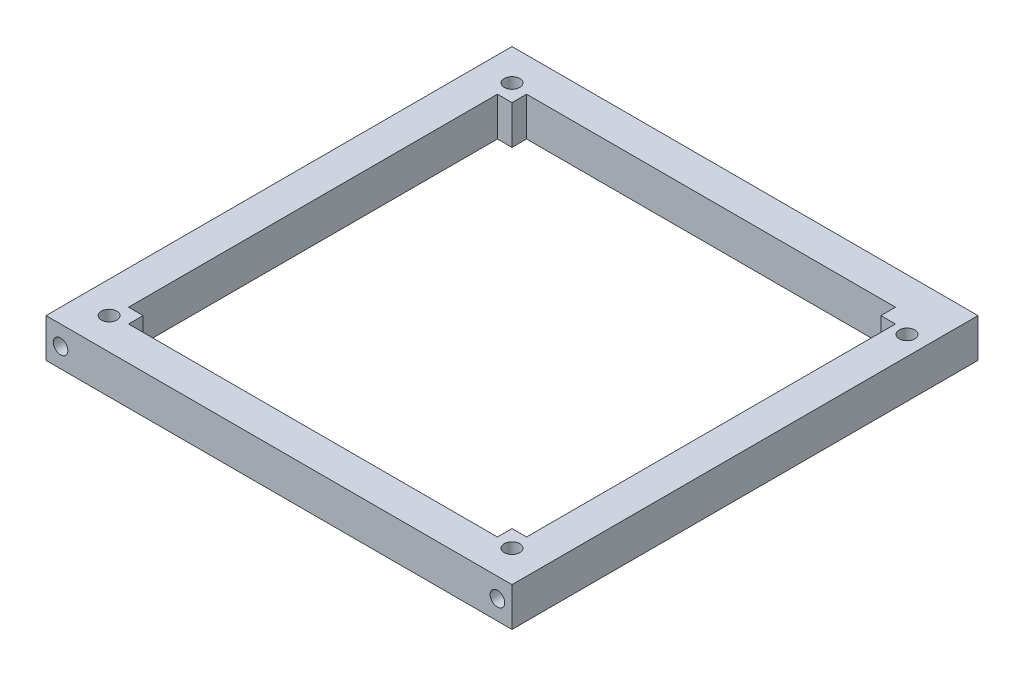
ISO-10303-21;
HEADER;
FILE_DESCRIPTION(('STEP AP214'),'2;1');
FILE_NAME('part.step','',(''),(''),'','','');
FILE_SCHEMA(('AUTOMOTIVE_DESIGN { 1 0 10303 214 1 1 1 1 }'));
ENDSEC;
DATA;
#1=APPLICATION_CONTEXT('core data for automotive mechanical design processes');
#2=APPLICATION_PROTOCOL_DEFINITION('international standard','automotive_design',2000,#1);
#3=PRODUCT_CONTEXT('',#1,'mechanical');
#4=PRODUCT('Part','Part','',(#3));
#5=PRODUCT_RELATED_PRODUCT_CATEGORY('part','',(#4));
#6=PRODUCT_DEFINITION_FORMATION('','',#4);
#7=PRODUCT_DEFINITION_CONTEXT('part definition',#1,'design');
#8=PRODUCT_DEFINITION('design','',#6,#7);
#9=PRODUCT_DEFINITION_SHAPE('','',#8);
#10=(LENGTH_UNIT() NAMED_UNIT(*) SI_UNIT(.MILLI.,.METRE.));
#11=(NAMED_UNIT(*) PLANE_ANGLE_UNIT() SI_UNIT($,.RADIAN.));
#12=(NAMED_UNIT(*) SI_UNIT($,.STERADIAN.) SOLID_ANGLE_UNIT());
#13=UNCERTAINTY_MEASURE_WITH_UNIT(LENGTH_MEASURE(1.E-05),#10,'distance_accuracy_value','');
#14=(GEOMETRIC_REPRESENTATION_CONTEXT(3) GLOBAL_UNCERTAINTY_ASSIGNED_CONTEXT((#13)) GLOBAL_UNIT_ASSIGNED_CONTEXT((#10,
#11,#12)) REPRESENTATION_CONTEXT('',''));
#15=CARTESIAN_POINT('',(0.,0.,0.));
#16=DIRECTION('',(0.,0.,1.));
#17=DIRECTION('',(1.,0.,0.));
#18=AXIS2_PLACEMENT_3D('',#15,#16,#17);
#19=CARTESIAN_POINT('',(0.,8.,0.));
#20=DIRECTION('',(0.,1.,0.));
#21=DIRECTION('',(0.,0.,1.));
#22=AXIS2_PLACEMENT_3D('',#19,#20,#21);
#23=PLANE('',#22);
#24=CARTESIAN_POINT('',(44.05,8.,-37.33));
#25=DIRECTION('',(0.,1.,0.));
#26=DIRECTION('',(0.,0.,1.));
#27=AXIS2_PLACEMENT_3D('',#24,#25,#26);
#28=CIRCLE('',#27,1.59999999999999);
#29=CARTESIAN_POINT('',(44.05,8.,-35.73));
#30=VERTEX_POINT('',#29);
#31=EDGE_CURVE('E542',#30,#30,#28,.T.);
#32=ORIENTED_EDGE('',*,*,#31,.F.);
#33=EDGE_LOOP('',(#32));
#34=FACE_BOUND('',#33,.T.);
#35=CARTESIAN_POINT('',(41.5,8.,41.5));
#36=DIRECTION('',(0.,1.,0.));
#37=DIRECTION('',(0.,0.,1.));
#38=AXIS2_PLACEMENT_3D('',#35,#36,#37);
#39=CIRCLE('',#38,1.59999999999999);
#40=CARTESIAN_POINT('',(41.5,8.,43.1));
#41=VERTEX_POINT('',#40);
#42=EDGE_CURVE('E544',#41,#41,#39,.T.);
#43=ORIENTED_EDGE('',*,*,#42,.F.);
#44=EDGE_LOOP('',(#43));
#45=FACE_BOUND('',#44,.T.);
#46=CARTESIAN_POINT('',(-41.5,8.,41.5));
#47=DIRECTION('',(0.,1.,0.));
#48=DIRECTION('',(0.,0.,1.));
#49=AXIS2_PLACEMENT_3D('',#46,#47,#48);
#50=CIRCLE('',#49,1.59999999999998);
#51=CARTESIAN_POINT('',(-41.5,8.,43.1));
#52=VERTEX_POINT('',#51);
#53=EDGE_CURVE('E552',#52,#52,#50,.T.);
#54=ORIENTED_EDGE('',*,*,#53,.F.);
#55=EDGE_LOOP('',(#54));
#56=FACE_BOUND('',#55,.T.);
#57=CARTESIAN_POINT('',(-41.5,8.,-41.5));
#58=DIRECTION('',(0.,1.,0.));
#59=DIRECTION('',(0.,0.,1.));
#60=AXIS2_PLACEMENT_3D('',#57,#58,#59);
#61=CIRCLE('',#60,1.59999999999998);
#62=CARTESIAN_POINT('',(-41.5,8.,-39.9));
#63=VERTEX_POINT('',#62);
#64=EDGE_CURVE('E557',#63,#63,#61,.T.);
#65=ORIENTED_EDGE('',*,*,#64,.F.);
#66=EDGE_LOOP('',(#65));
#67=FACE_BOUND('',#66,.T.);
#68=DIRECTION('',(0.,0.,-1.));
#69=VECTOR('',#68,1.);
#70=CARTESIAN_POINT('',(41.,8.,41.));
#71=LINE('',#70,#69);
#72=CARTESIAN_POINT('',(41.,8.,38.));
#73=VERTEX_POINT('',#72);
#74=CARTESIAN_POINT('',(41.,8.,-38.));
#75=VERTEX_POINT('',#74);
#76=EDGE_CURVE('E238',#73,#75,#71,.T.);
#77=ORIENTED_EDGE('',*,*,#76,.F.);
#78=DIRECTION('',(-1.,0.,0.));
#79=VECTOR('',#78,1.);
#80=CARTESIAN_POINT('',(41.,8.,38.));
#81=LINE('',#80,#79);
#82=CARTESIAN_POINT('',(38.,8.,38.));
#83=VERTEX_POINT('',#82);
#84=EDGE_CURVE('E176',#73,#83,#81,.T.);
#85=ORIENTED_EDGE('',*,*,#84,.T.);
#86=DIRECTION('',(0.,0.,1.));
#87=VECTOR('',#86,1.);
#88=CARTESIAN_POINT('',(38.,8.,41.));
#89=LINE('',#88,#87);
#90=CARTESIAN_POINT('',(38.,8.,41.));
#91=VERTEX_POINT('',#90);
#92=EDGE_CURVE('E183',#83,#91,#89,.T.);
#93=ORIENTED_EDGE('',*,*,#92,.T.);
#94=DIRECTION('',(1.,0.,0.));
#95=VECTOR('',#94,1.);
#96=CARTESIAN_POINT('',(41.,8.,41.));
#97=LINE('',#96,#95);
#98=CARTESIAN_POINT('',(-38.,8.,41.));
#99=VERTEX_POINT('',#98);
#100=EDGE_CURVE('E236',#99,#91,#97,.T.);
#101=ORIENTED_EDGE('',*,*,#100,.F.);
#102=DIRECTION('',(0.,0.,-1.));
#103=VECTOR('',#102,1.);
#104=CARTESIAN_POINT('',(-38.,8.,41.));
#105=LINE('',#104,#103);
#106=CARTESIAN_POINT('',(-38.,8.,38.));
#107=VERTEX_POINT('',#106);
#108=EDGE_CURVE('E169',#99,#107,#105,.T.);
#109=ORIENTED_EDGE('',*,*,#108,.T.);
#110=DIRECTION('',(-1.,0.,0.));
#111=VECTOR('',#110,1.);
#112=CARTESIAN_POINT('',(-41.,8.,38.));
#113=LINE('',#112,#111);
#114=CARTESIAN_POINT('',(-41.,8.,38.));
#115=VERTEX_POINT('',#114);
#116=EDGE_CURVE('E150',#107,#115,#113,.T.);
#117=ORIENTED_EDGE('',*,*,#116,.T.);
#118=DIRECTION('',(0.,0.,1.));
#119=VECTOR('',#118,1.);
#120=CARTESIAN_POINT('',(-41.,8.,41.));
#121=LINE('',#120,#119);
#122=CARTESIAN_POINT('',(-41.,8.,-38.));
#123=VERTEX_POINT('',#122);
#124=EDGE_CURVE('E50',#123,#115,#121,.T.);
#125=ORIENTED_EDGE('',*,*,#124,.F.);
#126=DIRECTION('',(1.,0.,0.));
#127=VECTOR('',#126,1.);
#128=CARTESIAN_POINT('',(-41.,8.,-38.));
#129=LINE('',#128,#127);
#130=CARTESIAN_POINT('',(-38.,8.,-38.));
#131=VERTEX_POINT('',#130);
#132=EDGE_CURVE('E213',#123,#131,#129,.T.);
#133=ORIENTED_EDGE('',*,*,#132,.T.);
#134=DIRECTION('',(0.,0.,-1.));
#135=VECTOR('',#134,1.);
#136=CARTESIAN_POINT('',(-38.,8.,-41.));
#137=LINE('',#136,#135);
#138=CARTESIAN_POINT('',(-38.,8.,-41.));
#139=VERTEX_POINT('',#138);
#140=EDGE_CURVE('E221',#131,#139,#137,.T.);
#141=ORIENTED_EDGE('',*,*,#140,.T.);
#142=DIRECTION('',(-1.,0.,0.));
#143=VECTOR('',#142,1.);
#144=CARTESIAN_POINT('',(41.,8.,-41.));
#145=LINE('',#144,#143);
#146=CARTESIAN_POINT('',(38.,8.,-41.));
#147=VERTEX_POINT('',#146);
#148=EDGE_CURVE('E240',#147,#139,#145,.T.);
#149=ORIENTED_EDGE('',*,*,#148,.F.);
#150=DIRECTION('',(0.,0.,1.));
#151=VECTOR('',#150,1.);
#152=CARTESIAN_POINT('',(38.,8.,-41.));
#153=LINE('',#152,#151);
#154=CARTESIAN_POINT('',(38.,8.,-38.));
#155=VERTEX_POINT('',#154);
#156=EDGE_CURVE('E194',#147,#155,#153,.T.);
#157=ORIENTED_EDGE('',*,*,#156,.T.);
#158=DIRECTION('',(1.,0.,0.));
#159=VECTOR('',#158,1.);
#160=CARTESIAN_POINT('',(41.,8.,-38.));
#161=LINE('',#160,#159);
#162=EDGE_CURVE('E202',#155,#75,#161,.T.);
#163=ORIENTED_EDGE('',*,*,#162,.T.);
#164=EDGE_LOOP('',(#77,#85,#93,#101,#109,#117,#125,#133,#141,#149,#157,#163));
#165=FACE_BOUND('',#164,.T.);
#166=DIRECTION('',(0.,0.,1.));
#167=VECTOR('',#166,1.);
#168=CARTESIAN_POINT('',(-48.,8.,48.));
#169=LINE('',#168,#167);
#170=CARTESIAN_POINT('',(-48.,8.,-48.));
#171=VERTEX_POINT('',#170);
#172=CARTESIAN_POINT('',(-48.,8.,48.));
#173=VERTEX_POINT('',#172);
#174=EDGE_CURVE('E267',#171,#173,#169,.T.);
#175=ORIENTED_EDGE('',*,*,#174,.T.);
#176=DIRECTION('',(1.,0.,0.));
#177=VECTOR('',#176,1.);
#178=CARTESIAN_POINT('',(48.,8.,48.));
#179=LINE('',#178,#177);
#180=CARTESIAN_POINT('',(48.,8.,48.));
#181=VERTEX_POINT('',#180);
#182=EDGE_CURVE('E270',#173,#181,#179,.T.);
#183=ORIENTED_EDGE('',*,*,#182,.T.);
#184=DIRECTION('',(0.,0.,-1.));
#185=VECTOR('',#184,1.);
#186=CARTESIAN_POINT('',(48.,8.,48.));
#187=LINE('',#186,#185);
#188=CARTESIAN_POINT('',(48.,8.,-48.));
#189=VERTEX_POINT('',#188);
#190=EDGE_CURVE('E273',#181,#189,#187,.T.);
#191=ORIENTED_EDGE('',*,*,#190,.T.);
#192=DIRECTION('',(-1.,0.,0.));
#193=VECTOR('',#192,1.);
#194=CARTESIAN_POINT('',(48.,8.,-48.));
#195=LINE('',#194,#193);
#196=EDGE_CURVE('E275',#189,#171,#195,.T.);
#197=ORIENTED_EDGE('',*,*,#196,.T.);
#198=EDGE_LOOP('',(#175,#183,#191,#197));
#199=FACE_BOUND('',#198,.T.);
#200=ADVANCED_FACE('F35',(#34,#45,#56,#67,#165,#199),#23,.T.);
#201=CARTESIAN_POINT('',(0.,0.,0.));
#202=DIRECTION('',(0.,1.,0.));
#203=DIRECTION('',(0.,0.,1.));
#204=AXIS2_PLACEMENT_3D('',#201,#202,#203);
#205=PLANE('',#204);
#206=CARTESIAN_POINT('',(44.05,0.,-37.33));
#207=DIRECTION('',(0.,1.,0.));
#208=DIRECTION('',(0.,0.,1.));
#209=AXIS2_PLACEMENT_3D('',#206,#207,#208);
#210=CIRCLE('',#209,1.6);
#211=CARTESIAN_POINT('',(44.05,0.,-35.73));
#212=VERTEX_POINT('',#211);
#213=EDGE_CURVE('E540',#212,#212,#210,.T.);
#214=ORIENTED_EDGE('',*,*,#213,.T.);
#215=EDGE_LOOP('',(#214));
#216=FACE_BOUND('',#215,.T.);
#217=CARTESIAN_POINT('',(41.5,0.,41.5));
#218=DIRECTION('',(0.,1.,0.));
#219=DIRECTION('',(0.,0.,1.));
#220=AXIS2_PLACEMENT_3D('',#217,#218,#219);
#221=CIRCLE('',#220,1.6);
#222=CARTESIAN_POINT('',(41.5,0.,43.1));
#223=VERTEX_POINT('',#222);
#224=EDGE_CURVE('E549',#223,#223,#221,.T.);
#225=ORIENTED_EDGE('',*,*,#224,.T.);
#226=EDGE_LOOP('',(#225));
#227=FACE_BOUND('',#226,.T.);
#228=CARTESIAN_POINT('',(-41.5,0.,41.5));
#229=DIRECTION('',(0.,1.,0.));
#230=DIRECTION('',(0.,0.,1.));
#231=AXIS2_PLACEMENT_3D('',#228,#229,#230);
#232=CIRCLE('',#231,1.6);
#233=CARTESIAN_POINT('',(-41.5,0.,43.1));
#234=VERTEX_POINT('',#233);
#235=EDGE_CURVE('E555',#234,#234,#232,.T.);
#236=ORIENTED_EDGE('',*,*,#235,.T.);
#237=EDGE_LOOP('',(#236));
#238=FACE_BOUND('',#237,.T.);
#239=CARTESIAN_POINT('',(-41.5,0.,-41.5));
#240=DIRECTION('',(0.,1.,0.));
#241=DIRECTION('',(0.,0.,1.));
#242=AXIS2_PLACEMENT_3D('',#239,#240,#241);
#243=CIRCLE('',#242,1.6);
#244=CARTESIAN_POINT('',(-41.5,0.,-39.9));
#245=VERTEX_POINT('',#244);
#246=EDGE_CURVE('E172',#245,#245,#243,.T.);
#247=ORIENTED_EDGE('',*,*,#246,.T.);
#248=EDGE_LOOP('',(#247));
#249=FACE_BOUND('',#248,.T.);
#250=DIRECTION('',(-1.,0.,0.));
#251=VECTOR('',#250,1.);
#252=CARTESIAN_POINT('',(41.,0.,38.));
#253=LINE('',#252,#251);
#254=CARTESIAN_POINT('',(41.,0.,38.));
#255=VERTEX_POINT('',#254);
#256=CARTESIAN_POINT('',(38.,0.,38.));
#257=VERTEX_POINT('',#256);
#258=EDGE_CURVE('E179',#255,#257,#253,.T.);
#259=ORIENTED_EDGE('',*,*,#258,.F.);
#260=DIRECTION('',(0.,0.,-1.));
#261=VECTOR('',#260,1.);
#262=CARTESIAN_POINT('',(41.,0.,0.));
#263=LINE('',#262,#261);
#264=CARTESIAN_POINT('',(41.,0.,-38.));
#265=VERTEX_POINT('',#264);
#266=EDGE_CURVE('E298',#255,#265,#263,.T.);
#267=ORIENTED_EDGE('',*,*,#266,.T.);
#268=DIRECTION('',(1.,0.,0.));
#269=VECTOR('',#268,1.);
#270=CARTESIAN_POINT('',(41.,0.,-38.));
#271=LINE('',#270,#269);
#272=CARTESIAN_POINT('',(38.,0.,-38.));
#273=VERTEX_POINT('',#272);
#274=EDGE_CURVE('E201',#273,#265,#271,.T.);
#275=ORIENTED_EDGE('',*,*,#274,.F.);
#276=DIRECTION('',(0.,0.,1.));
#277=VECTOR('',#276,1.);
#278=CARTESIAN_POINT('',(38.,0.,-41.));
#279=LINE('',#278,#277);
#280=CARTESIAN_POINT('',(38.,0.,-41.));
#281=VERTEX_POINT('',#280);
#282=EDGE_CURVE('E198',#281,#273,#279,.T.);
#283=ORIENTED_EDGE('',*,*,#282,.F.);
#284=DIRECTION('',(-1.,0.,0.));
#285=VECTOR('',#284,1.);
#286=CARTESIAN_POINT('',(0.,0.,-41.));
#287=LINE('',#286,#285);
#288=CARTESIAN_POINT('',(-38.,0.,-41.));
#289=VERTEX_POINT('',#288);
#290=EDGE_CURVE('E43',#281,#289,#287,.T.);
#291=ORIENTED_EDGE('',*,*,#290,.T.);
#292=DIRECTION('',(0.,0.,-1.));
#293=VECTOR('',#292,1.);
#294=CARTESIAN_POINT('',(-38.,0.,-41.));
#295=LINE('',#294,#293);
#296=CARTESIAN_POINT('',(-38.,0.,-38.));
#297=VERTEX_POINT('',#296);
#298=EDGE_CURVE('E220',#297,#289,#295,.T.);
#299=ORIENTED_EDGE('',*,*,#298,.F.);
#300=DIRECTION('',(1.,0.,0.));
#301=VECTOR('',#300,1.);
#302=CARTESIAN_POINT('',(-41.,0.,-38.));
#303=LINE('',#302,#301);
#304=CARTESIAN_POINT('',(-41.,0.,-38.));
#305=VERTEX_POINT('',#304);
#306=EDGE_CURVE('E217',#305,#297,#303,.T.);
#307=ORIENTED_EDGE('',*,*,#306,.F.);
#308=DIRECTION('',(0.,0.,1.));
#309=VECTOR('',#308,1.);
#310=CARTESIAN_POINT('',(-41.,0.,0.));
#311=LINE('',#310,#309);
#312=CARTESIAN_POINT('',(-41.,0.,38.));
#313=VERTEX_POINT('',#312);
#314=EDGE_CURVE('E11',#305,#313,#311,.T.);
#315=ORIENTED_EDGE('',*,*,#314,.T.);
#316=DIRECTION('',(-1.,0.,0.));
#317=VECTOR('',#316,1.);
#318=CARTESIAN_POINT('',(-41.,0.,38.));
#319=LINE('',#318,#317);
#320=CARTESIAN_POINT('',(-38.,0.,38.));
#321=VERTEX_POINT('',#320);
#322=EDGE_CURVE('E148',#321,#313,#319,.T.);
#323=ORIENTED_EDGE('',*,*,#322,.F.);
#324=DIRECTION('',(0.,0.,-1.));
#325=VECTOR('',#324,1.);
#326=CARTESIAN_POINT('',(-38.,0.,41.));
#327=LINE('',#326,#325);
#328=CARTESIAN_POINT('',(-38.,0.,41.));
#329=VERTEX_POINT('',#328);
#330=EDGE_CURVE('E162',#329,#321,#327,.T.);
#331=ORIENTED_EDGE('',*,*,#330,.F.);
#332=DIRECTION('',(1.,0.,0.));
#333=VECTOR('',#332,1.);
#334=CARTESIAN_POINT('',(0.,0.,41.));
#335=LINE('',#334,#333);
#336=CARTESIAN_POINT('',(38.,0.,41.));
#337=VERTEX_POINT('',#336);
#338=EDGE_CURVE('E296',#329,#337,#335,.T.);
#339=ORIENTED_EDGE('',*,*,#338,.T.);
#340=DIRECTION('',(0.,0.,1.));
#341=VECTOR('',#340,1.);
#342=CARTESIAN_POINT('',(38.,0.,41.));
#343=LINE('',#342,#341);
#344=EDGE_CURVE('E182',#257,#337,#343,.T.);
#345=ORIENTED_EDGE('',*,*,#344,.F.);
#346=EDGE_LOOP('',(#259,#267,#275,#283,#291,#299,#307,#315,#323,#331,#339,#345));
#347=FACE_BOUND('',#346,.T.);
#348=DIRECTION('',(0.,0.,1.));
#349=VECTOR('',#348,1.);
#350=CARTESIAN_POINT('',(-48.,0.,48.));
#351=LINE('',#350,#349);
#352=CARTESIAN_POINT('',(-48.,0.,-48.));
#353=VERTEX_POINT('',#352);
#354=CARTESIAN_POINT('',(-48.,0.,48.));
#355=VERTEX_POINT('',#354);
#356=EDGE_CURVE('E266',#353,#355,#351,.T.);
#357=ORIENTED_EDGE('',*,*,#356,.F.);
#358=DIRECTION('',(-1.,0.,0.));
#359=VECTOR('',#358,1.);
#360=CARTESIAN_POINT('',(48.,0.,-48.));
#361=LINE('',#360,#359);
#362=CARTESIAN_POINT('',(48.,0.,-48.));
#363=VERTEX_POINT('',#362);
#364=EDGE_CURVE('E271',#363,#353,#361,.T.);
#365=ORIENTED_EDGE('',*,*,#364,.F.);
#366=DIRECTION('',(0.,0.,-1.));
#367=VECTOR('',#366,1.);
#368=CARTESIAN_POINT('',(48.,0.,48.));
#369=LINE('',#368,#367);
#370=CARTESIAN_POINT('',(48.,0.,48.));
#371=VERTEX_POINT('',#370);
#372=EDGE_CURVE('E282',#371,#363,#369,.T.);
#373=ORIENTED_EDGE('',*,*,#372,.F.);
#374=DIRECTION('',(1.,0.,0.));
#375=VECTOR('',#374,1.);
#376=CARTESIAN_POINT('',(48.,0.,48.));
#377=LINE('',#376,#375);
#378=EDGE_CURVE('E280',#355,#371,#377,.T.);
#379=ORIENTED_EDGE('',*,*,#378,.F.);
#380=EDGE_LOOP('',(#357,#365,#373,#379));
#381=FACE_BOUND('',#380,.T.);
#382=ADVANCED_FACE('F160',(#216,#227,#238,#249,#347,#381),#205,.F.);
#383=CARTESIAN_POINT('',(-48.,8.,48.));
#384=DIRECTION('',(1.,0.,0.));
#385=DIRECTION('',(0.,0.,-1.));
#386=AXIS2_PLACEMENT_3D('',#383,#384,#385);
#387=PLANE('',#386);
#388=ORIENTED_EDGE('',*,*,#356,.T.);
#389=DIRECTION('',(0.,-1.,0.));
#390=VECTOR('',#389,1.);
#391=CARTESIAN_POINT('',(-48.,8.,48.));
#392=LINE('',#391,#390);
#393=EDGE_CURVE('E293',#173,#355,#392,.T.);
#394=ORIENTED_EDGE('',*,*,#393,.F.);
#395=ORIENTED_EDGE('',*,*,#174,.F.);
#396=DIRECTION('',(0.,-1.,0.));
#397=VECTOR('',#396,1.);
#398=CARTESIAN_POINT('',(-48.,8.,-48.));
#399=LINE('',#398,#397);
#400=EDGE_CURVE('E277',#171,#353,#399,.T.);
#401=ORIENTED_EDGE('',*,*,#400,.T.);
#402=EDGE_LOOP('',(#388,#394,#395,#401));
#403=FACE_BOUND('',#402,.T.);
#404=ADVANCED_FACE('F37',(#403),#387,.F.);
#405=CARTESIAN_POINT('',(48.,8.,48.));
#406=DIRECTION('',(0.,0.,-1.));
#407=DIRECTION('',(-1.,0.,0.));
#408=AXIS2_PLACEMENT_3D('',#405,#406,#407);
#409=PLANE('',#408);
#410=CARTESIAN_POINT('',(45.,4.,48.));
#411=DIRECTION('',(0.,0.,1.));
#412=DIRECTION('',(1.,0.,0.));
#413=AXIS2_PLACEMENT_3D('',#410,#411,#412);
#414=CIRCLE('',#413,1.49999999999999);
#415=CARTESIAN_POINT('',(46.5,4.,48.));
#416=VERTEX_POINT('',#415);
#417=EDGE_CURVE('E254',#416,#416,#414,.T.);
#418=ORIENTED_EDGE('',*,*,#417,.F.);
#419=EDGE_LOOP('',(#418));
#420=FACE_BOUND('',#419,.T.);
#421=CARTESIAN_POINT('',(-45.,4.,48.));
#422=DIRECTION('',(0.,0.,1.));
#423=DIRECTION('',(1.,0.,0.));
#424=AXIS2_PLACEMENT_3D('',#421,#422,#423);
#425=CIRCLE('',#424,1.49999999999999);
#426=CARTESIAN_POINT('',(-43.5,4.,48.));
#427=VERTEX_POINT('',#426);
#428=EDGE_CURVE('E260',#427,#427,#425,.T.);
#429=ORIENTED_EDGE('',*,*,#428,.F.);
#430=EDGE_LOOP('',(#429));
#431=FACE_BOUND('',#430,.T.);
#432=ORIENTED_EDGE('',*,*,#378,.T.);
#433=DIRECTION('',(0.,-1.,0.));
#434=VECTOR('',#433,1.);
#435=CARTESIAN_POINT('',(48.,8.,48.));
#436=LINE('',#435,#434);
#437=EDGE_CURVE('E290',#181,#371,#436,.T.);
#438=ORIENTED_EDGE('',*,*,#437,.F.);
#439=ORIENTED_EDGE('',*,*,#182,.F.);
#440=ORIENTED_EDGE('',*,*,#393,.T.);
#441=EDGE_LOOP('',(#432,#438,#439,#440));
#442=FACE_BOUND('',#441,.T.);
#443=ADVANCED_FACE('F367',(#420,#431,#442),#409,.F.);
#444=CARTESIAN_POINT('',(48.,8.,48.));
#445=DIRECTION('',(-1.,0.,0.));
#446=DIRECTION('',(0.,0.,1.));
#447=AXIS2_PLACEMENT_3D('',#444,#445,#446);
#448=PLANE('',#447);
#449=ORIENTED_EDGE('',*,*,#372,.T.);
#450=DIRECTION('',(0.,-1.,0.));
#451=VECTOR('',#450,1.);
#452=CARTESIAN_POINT('',(48.,8.,-48.));
#453=LINE('',#452,#451);
#454=EDGE_CURVE('E287',#189,#363,#453,.T.);
#455=ORIENTED_EDGE('',*,*,#454,.F.);
#456=ORIENTED_EDGE('',*,*,#190,.F.);
#457=ORIENTED_EDGE('',*,*,#437,.T.);
#458=EDGE_LOOP('',(#449,#455,#456,#457));
#459=FACE_BOUND('',#458,.T.);
#460=ADVANCED_FACE('F364',(#459),#448,.F.);
#461=CARTESIAN_POINT('',(48.,8.,-48.));
#462=DIRECTION('',(0.,0.,1.));
#463=DIRECTION('',(1.,0.,0.));
#464=AXIS2_PLACEMENT_3D('',#461,#462,#463);
#465=PLANE('',#464);
#466=CARTESIAN_POINT('',(-45.,4.,-48.));
#467=DIRECTION('',(0.,0.,-1.));
#468=DIRECTION('',(-1.,0.,0.));
#469=AXIS2_PLACEMENT_3D('',#466,#467,#468);
#470=CIRCLE('',#469,1.49999999999999);
#471=CARTESIAN_POINT('',(-46.5,4.,-48.));
#472=VERTEX_POINT('',#471);
#473=EDGE_CURVE('E242',#472,#472,#470,.T.);
#474=ORIENTED_EDGE('',*,*,#473,.F.);
#475=EDGE_LOOP('',(#474));
#476=FACE_BOUND('',#475,.T.);
#477=CARTESIAN_POINT('',(45.,4.,-48.));
#478=DIRECTION('',(0.,0.,-1.));
#479=DIRECTION('',(-1.,0.,0.));
#480=AXIS2_PLACEMENT_3D('',#477,#478,#479);
#481=CIRCLE('',#480,1.49999999999999);
#482=CARTESIAN_POINT('',(43.5,4.,-48.));
#483=VERTEX_POINT('',#482);
#484=EDGE_CURVE('E248',#483,#483,#481,.T.);
#485=ORIENTED_EDGE('',*,*,#484,.F.);
#486=EDGE_LOOP('',(#485));
#487=FACE_BOUND('',#486,.T.);
#488=ORIENTED_EDGE('',*,*,#364,.T.);
#489=ORIENTED_EDGE('',*,*,#400,.F.);
#490=ORIENTED_EDGE('',*,*,#196,.F.);
#491=ORIENTED_EDGE('',*,*,#454,.T.);
#492=EDGE_LOOP('',(#488,#489,#490,#491));
#493=FACE_BOUND('',#492,.T.);
#494=ADVANCED_FACE('F361',(#476,#487,#493),#465,.F.);
#495=CARTESIAN_POINT('',(-45.,4.,42.));
#496=DIRECTION('',(0.,0.,-1.));
#497=DIRECTION('',(-1.,0.,0.));
#498=AXIS2_PLACEMENT_3D('',#495,#496,#497);
#499=PLANE('',#498);
#500=CARTESIAN_POINT('',(-45.,4.,42.));
#501=DIRECTION('',(0.,0.,1.));
#502=DIRECTION('',(1.,0.,0.));
#503=AXIS2_PLACEMENT_3D('',#500,#501,#502);
#504=CIRCLE('',#503,1.49999999999999);
#505=CARTESIAN_POINT('',(-43.5,4.,42.));
#506=VERTEX_POINT('',#505);
#507=EDGE_CURVE('E263',#506,#506,#504,.T.);
#508=ORIENTED_EDGE('',*,*,#507,.T.);
#509=EDGE_LOOP('',(#508));
#510=FACE_BOUND('',#509,.T.);
#511=ADVANCED_FACE('F358',(#510),#499,.F.);
#512=CARTESIAN_POINT('',(-45.,4.,48.));
#513=DIRECTION('',(0.,0.,1.));
#514=DIRECTION('',(1.,0.,0.));
#515=AXIS2_PLACEMENT_3D('',#512,#513,#514);
#516=CYLINDRICAL_SURFACE('',#515,1.49999999999999);
#517=ORIENTED_EDGE('',*,*,#507,.F.);
#518=EDGE_LOOP('',(#517));
#519=FACE_BOUND('',#518,.T.);
#520=ORIENTED_EDGE('',*,*,#428,.T.);
#521=EDGE_LOOP('',(#520));
#522=FACE_BOUND('',#521,.T.);
#523=ADVANCED_FACE('F391',(#519,#522),#516,.F.);
#524=CARTESIAN_POINT('',(45.,4.,42.));
#525=DIRECTION('',(0.,0.,-1.));
#526=DIRECTION('',(-1.,0.,0.));
#527=AXIS2_PLACEMENT_3D('',#524,#525,#526);
#528=PLANE('',#527);
#529=CARTESIAN_POINT('',(45.,4.,42.));
#530=DIRECTION('',(0.,0.,1.));
#531=DIRECTION('',(1.,0.,0.));
#532=AXIS2_PLACEMENT_3D('',#529,#530,#531);
#533=CIRCLE('',#532,1.49999999999999);
#534=CARTESIAN_POINT('',(46.5,4.,42.));
#535=VERTEX_POINT('',#534);
#536=EDGE_CURVE('E257',#535,#535,#533,.T.);
#537=ORIENTED_EDGE('',*,*,#536,.T.);
#538=EDGE_LOOP('',(#537));
#539=FACE_BOUND('',#538,.T.);
#540=ADVANCED_FACE('F393',(#539),#528,.F.);
#541=CARTESIAN_POINT('',(45.,4.,48.));
#542=DIRECTION('',(0.,0.,1.));
#543=DIRECTION('',(1.,0.,0.));
#544=AXIS2_PLACEMENT_3D('',#541,#542,#543);
#545=CYLINDRICAL_SURFACE('',#544,1.49999999999999);
#546=ORIENTED_EDGE('',*,*,#536,.F.);
#547=EDGE_LOOP('',(#546));
#548=FACE_BOUND('',#547,.T.);
#549=ORIENTED_EDGE('',*,*,#417,.T.);
#550=EDGE_LOOP('',(#549));
#551=FACE_BOUND('',#550,.T.);
#552=ADVANCED_FACE('F399',(#548,#551),#545,.F.);
#553=CARTESIAN_POINT('',(45.,4.,-42.));
#554=DIRECTION('',(0.,0.,1.));
#555=DIRECTION('',(1.,0.,0.));
#556=AXIS2_PLACEMENT_3D('',#553,#554,#555);
#557=PLANE('',#556);
#558=CARTESIAN_POINT('',(45.,4.,-42.));
#559=DIRECTION('',(0.,0.,-1.));
#560=DIRECTION('',(-1.,0.,0.));
#561=AXIS2_PLACEMENT_3D('',#558,#559,#560);
#562=CIRCLE('',#561,1.5);
#563=CARTESIAN_POINT('',(43.5,4.,-42.));
#564=VERTEX_POINT('',#563);
#565=EDGE_CURVE('E251',#564,#564,#562,.T.);
#566=ORIENTED_EDGE('',*,*,#565,.T.);
#567=EDGE_LOOP('',(#566));
#568=FACE_BOUND('',#567,.T.);
#569=ADVANCED_FACE('F407',(#568),#557,.F.);
#570=CARTESIAN_POINT('',(45.,4.,-48.));
#571=DIRECTION('',(0.,0.,-1.));
#572=DIRECTION('',(-1.,0.,0.));
#573=AXIS2_PLACEMENT_3D('',#570,#571,#572);
#574=CYLINDRICAL_SURFACE('',#573,1.49999999999999);
#575=ORIENTED_EDGE('',*,*,#565,.F.);
#576=EDGE_LOOP('',(#575));
#577=FACE_BOUND('',#576,.T.);
#578=ORIENTED_EDGE('',*,*,#484,.T.);
#579=EDGE_LOOP('',(#578));
#580=FACE_BOUND('',#579,.T.);
#581=ADVANCED_FACE('F411',(#577,#580),#574,.F.);
#582=CARTESIAN_POINT('',(-45.,4.,-42.));
#583=DIRECTION('',(0.,0.,1.));
#584=DIRECTION('',(1.,0.,0.));
#585=AXIS2_PLACEMENT_3D('',#582,#583,#584);
#586=PLANE('',#585);
#587=CARTESIAN_POINT('',(-45.,4.,-42.));
#588=DIRECTION('',(0.,0.,-1.));
#589=DIRECTION('',(-1.,0.,0.));
#590=AXIS2_PLACEMENT_3D('',#587,#588,#589);
#591=CIRCLE('',#590,1.5);
#592=CARTESIAN_POINT('',(-46.5,4.,-42.));
#593=VERTEX_POINT('',#592);
#594=EDGE_CURVE('E245',#593,#593,#591,.T.);
#595=ORIENTED_EDGE('',*,*,#594,.T.);
#596=EDGE_LOOP('',(#595));
#597=FACE_BOUND('',#596,.T.);
#598=ADVANCED_FACE('F415',(#597),#586,.F.);
#599=CARTESIAN_POINT('',(-45.,4.,-48.));
#600=DIRECTION('',(0.,0.,-1.));
#601=DIRECTION('',(-1.,0.,0.));
#602=AXIS2_PLACEMENT_3D('',#599,#600,#601);
#603=CYLINDRICAL_SURFACE('',#602,1.49999999999999);
#604=ORIENTED_EDGE('',*,*,#594,.F.);
#605=EDGE_LOOP('',(#604));
#606=FACE_BOUND('',#605,.T.);
#607=ORIENTED_EDGE('',*,*,#473,.T.);
#608=EDGE_LOOP('',(#607));
#609=FACE_BOUND('',#608,.T.);
#610=ADVANCED_FACE('F419',(#606,#609),#603,.F.);
#611=CARTESIAN_POINT('',(-41.,-2.,41.));
#612=DIRECTION('',(-1.,0.,0.));
#613=DIRECTION('',(0.,0.,1.));
#614=AXIS2_PLACEMENT_3D('',#611,#612,#613);
#615=PLANE('',#614);
#616=ORIENTED_EDGE('',*,*,#124,.T.);
#617=DIRECTION('',(0.,1.,0.));
#618=VECTOR('',#617,1.);
#619=CARTESIAN_POINT('',(-41.,0.,38.));
#620=LINE('',#619,#618);
#621=EDGE_CURVE('E54',#313,#115,#620,.T.);
#622=ORIENTED_EDGE('',*,*,#621,.F.);
#623=ORIENTED_EDGE('',*,*,#314,.F.);
#624=DIRECTION('',(0.,1.,0.));
#625=VECTOR('',#624,1.);
#626=CARTESIAN_POINT('',(-41.,0.,-38.));
#627=LINE('',#626,#625);
#628=EDGE_CURVE('E224',#305,#123,#627,.T.);
#629=ORIENTED_EDGE('',*,*,#628,.T.);
#630=EDGE_LOOP('',(#616,#622,#623,#629));
#631=FACE_BOUND('',#630,.T.);
#632=ADVANCED_FACE('F314',(#631),#615,.F.);
#633=CARTESIAN_POINT('',(41.,-2.,-41.));
#634=DIRECTION('',(0.,0.,-1.));
#635=DIRECTION('',(-1.,0.,0.));
#636=AXIS2_PLACEMENT_3D('',#633,#634,#635);
#637=PLANE('',#636);
#638=ORIENTED_EDGE('',*,*,#290,.F.);
#639=DIRECTION('',(0.,1.,0.));
#640=VECTOR('',#639,1.);
#641=CARTESIAN_POINT('',(38.,0.,-41.));
#642=LINE('',#641,#640);
#643=EDGE_CURVE('E205',#281,#147,#642,.T.);
#644=ORIENTED_EDGE('',*,*,#643,.T.);
#645=ORIENTED_EDGE('',*,*,#148,.T.);
#646=DIRECTION('',(0.,1.,0.));
#647=VECTOR('',#646,1.);
#648=CARTESIAN_POINT('',(-38.,0.,-41.));
#649=LINE('',#648,#647);
#650=EDGE_CURVE('E229',#289,#139,#649,.T.);
#651=ORIENTED_EDGE('',*,*,#650,.F.);
#652=EDGE_LOOP('',(#638,#644,#645,#651));
#653=FACE_BOUND('',#652,.T.);
#654=ADVANCED_FACE('F305',(#653),#637,.F.);
#655=CARTESIAN_POINT('',(41.,-2.,41.));
#656=DIRECTION('',(1.,0.,0.));
#657=DIRECTION('',(0.,0.,-1.));
#658=AXIS2_PLACEMENT_3D('',#655,#656,#657);
#659=PLANE('',#658);
#660=ORIENTED_EDGE('',*,*,#266,.F.);
#661=DIRECTION('',(0.,1.,0.));
#662=VECTOR('',#661,1.);
#663=CARTESIAN_POINT('',(41.,0.,38.));
#664=LINE('',#663,#662);
#665=EDGE_CURVE('E186',#255,#73,#664,.T.);
#666=ORIENTED_EDGE('',*,*,#665,.T.);
#667=ORIENTED_EDGE('',*,*,#76,.T.);
#668=DIRECTION('',(0.,1.,0.));
#669=VECTOR('',#668,1.);
#670=CARTESIAN_POINT('',(41.,0.,-38.));
#671=LINE('',#670,#669);
#672=EDGE_CURVE('E210',#265,#75,#671,.T.);
#673=ORIENTED_EDGE('',*,*,#672,.F.);
#674=EDGE_LOOP('',(#660,#666,#667,#673));
#675=FACE_BOUND('',#674,.T.);
#676=ADVANCED_FACE('F329',(#675),#659,.F.);
#677=CARTESIAN_POINT('',(41.,-2.,41.));
#678=DIRECTION('',(0.,0.,1.));
#679=DIRECTION('',(1.,0.,0.));
#680=AXIS2_PLACEMENT_3D('',#677,#678,#679);
#681=PLANE('',#680);
#682=ORIENTED_EDGE('',*,*,#338,.F.);
#683=DIRECTION('',(0.,1.,0.));
#684=VECTOR('',#683,1.);
#685=CARTESIAN_POINT('',(-38.,0.,41.));
#686=LINE('',#685,#684);
#687=EDGE_CURVE('E155',#329,#99,#686,.T.);
#688=ORIENTED_EDGE('',*,*,#687,.T.);
#689=ORIENTED_EDGE('',*,*,#100,.T.);
#690=DIRECTION('',(0.,1.,0.));
#691=VECTOR('',#690,1.);
#692=CARTESIAN_POINT('',(38.,0.,41.));
#693=LINE('',#692,#691);
#694=EDGE_CURVE('E191',#337,#91,#693,.T.);
#695=ORIENTED_EDGE('',*,*,#694,.F.);
#696=EDGE_LOOP('',(#682,#688,#689,#695));
#697=FACE_BOUND('',#696,.T.);
#698=ADVANCED_FACE('F321',(#697),#681,.F.);
#699=CARTESIAN_POINT('',(-38.,0.,-41.));
#700=DIRECTION('',(1.,0.,0.));
#701=DIRECTION('',(0.,0.,-1.));
#702=AXIS2_PLACEMENT_3D('',#699,#700,#701);
#703=PLANE('',#702);
#704=ORIENTED_EDGE('',*,*,#140,.F.);
#705=DIRECTION('',(0.,1.,0.));
#706=VECTOR('',#705,1.);
#707=CARTESIAN_POINT('',(-38.,0.,-38.));
#708=LINE('',#707,#706);
#709=EDGE_CURVE('E232',#297,#131,#708,.T.);
#710=ORIENTED_EDGE('',*,*,#709,.F.);
#711=ORIENTED_EDGE('',*,*,#298,.T.);
#712=ORIENTED_EDGE('',*,*,#650,.T.);
#713=EDGE_LOOP('',(#704,#710,#711,#712));
#714=FACE_BOUND('',#713,.T.);
#715=ADVANCED_FACE('F309',(#714),#703,.T.);
#716=CARTESIAN_POINT('',(-41.,0.,-38.));
#717=DIRECTION('',(0.,0.,1.));
#718=DIRECTION('',(1.,0.,0.));
#719=AXIS2_PLACEMENT_3D('',#716,#717,#718);
#720=PLANE('',#719);
#721=ORIENTED_EDGE('',*,*,#132,.F.);
#722=ORIENTED_EDGE('',*,*,#628,.F.);
#723=ORIENTED_EDGE('',*,*,#306,.T.);
#724=ORIENTED_EDGE('',*,*,#709,.T.);
#725=EDGE_LOOP('',(#721,#722,#723,#724));
#726=FACE_BOUND('',#725,.T.);
#727=ADVANCED_FACE('F312',(#726),#720,.T.);
#728=CARTESIAN_POINT('',(41.,0.,-38.));
#729=DIRECTION('',(0.,0.,1.));
#730=DIRECTION('',(1.,0.,0.));
#731=AXIS2_PLACEMENT_3D('',#728,#729,#730);
#732=PLANE('',#731);
#733=ORIENTED_EDGE('',*,*,#162,.F.);
#734=DIRECTION('',(0.,1.,0.));
#735=VECTOR('',#734,1.);
#736=CARTESIAN_POINT('',(38.,0.,-38.));
#737=LINE('',#736,#735);
#738=EDGE_CURVE('E214',#273,#155,#737,.T.);
#739=ORIENTED_EDGE('',*,*,#738,.F.);
#740=ORIENTED_EDGE('',*,*,#274,.T.);
#741=ORIENTED_EDGE('',*,*,#672,.T.);
#742=EDGE_LOOP('',(#733,#739,#740,#741));
#743=FACE_BOUND('',#742,.T.);
#744=ADVANCED_FACE('F334',(#743),#732,.T.);
#745=CARTESIAN_POINT('',(38.,0.,-41.));
#746=DIRECTION('',(-1.,0.,0.));
#747=DIRECTION('',(0.,0.,1.));
#748=AXIS2_PLACEMENT_3D('',#745,#746,#747);
#749=PLANE('',#748);
#750=ORIENTED_EDGE('',*,*,#156,.F.);
#751=ORIENTED_EDGE('',*,*,#643,.F.);
#752=ORIENTED_EDGE('',*,*,#282,.T.);
#753=ORIENTED_EDGE('',*,*,#738,.T.);
#754=EDGE_LOOP('',(#750,#751,#752,#753));
#755=FACE_BOUND('',#754,.T.);
#756=ADVANCED_FACE('F336',(#755),#749,.T.);
#757=CARTESIAN_POINT('',(38.,0.,41.));
#758=DIRECTION('',(-1.,0.,0.));
#759=DIRECTION('',(0.,0.,1.));
#760=AXIS2_PLACEMENT_3D('',#757,#758,#759);
#761=PLANE('',#760);
#762=ORIENTED_EDGE('',*,*,#92,.F.);
#763=DIRECTION('',(0.,1.,0.));
#764=VECTOR('',#763,1.);
#765=CARTESIAN_POINT('',(38.,0.,38.));
#766=LINE('',#765,#764);
#767=EDGE_CURVE('E195',#257,#83,#766,.T.);
#768=ORIENTED_EDGE('',*,*,#767,.F.);
#769=ORIENTED_EDGE('',*,*,#344,.T.);
#770=ORIENTED_EDGE('',*,*,#694,.T.);
#771=EDGE_LOOP('',(#762,#768,#769,#770));
#772=FACE_BOUND('',#771,.T.);
#773=ADVANCED_FACE('F338',(#772),#761,.T.);
#774=CARTESIAN_POINT('',(41.,0.,38.));
#775=DIRECTION('',(0.,0.,-1.));
#776=DIRECTION('',(-1.,0.,0.));
#777=AXIS2_PLACEMENT_3D('',#774,#775,#776);
#778=PLANE('',#777);
#779=ORIENTED_EDGE('',*,*,#84,.F.);
#780=ORIENTED_EDGE('',*,*,#665,.F.);
#781=ORIENTED_EDGE('',*,*,#258,.T.);
#782=ORIENTED_EDGE('',*,*,#767,.T.);
#783=EDGE_LOOP('',(#779,#780,#781,#782));
#784=FACE_BOUND('',#783,.T.);
#785=ADVANCED_FACE('F327',(#784),#778,.T.);
#786=CARTESIAN_POINT('',(-41.,0.,38.));
#787=DIRECTION('',(0.,0.,-1.));
#788=DIRECTION('',(-1.,0.,0.));
#789=AXIS2_PLACEMENT_3D('',#786,#787,#788);
#790=PLANE('',#789);
#791=ORIENTED_EDGE('',*,*,#116,.F.);
#792=DIRECTION('',(0.,1.,0.));
#793=VECTOR('',#792,1.);
#794=CARTESIAN_POINT('',(-38.,0.,38.));
#795=LINE('',#794,#793);
#796=EDGE_CURVE('E145',#321,#107,#795,.T.);
#797=ORIENTED_EDGE('',*,*,#796,.F.);
#798=ORIENTED_EDGE('',*,*,#322,.T.);
#799=ORIENTED_EDGE('',*,*,#621,.T.);
#800=EDGE_LOOP('',(#791,#797,#798,#799));
#801=FACE_BOUND('',#800,.T.);
#802=ADVANCED_FACE('F147',(#801),#790,.T.);
#803=CARTESIAN_POINT('',(-38.,0.,41.));
#804=DIRECTION('',(1.,0.,0.));
#805=DIRECTION('',(0.,0.,-1.));
#806=AXIS2_PLACEMENT_3D('',#803,#804,#805);
#807=PLANE('',#806);
#808=ORIENTED_EDGE('',*,*,#108,.F.);
#809=ORIENTED_EDGE('',*,*,#687,.F.);
#810=ORIENTED_EDGE('',*,*,#330,.T.);
#811=ORIENTED_EDGE('',*,*,#796,.T.);
#812=EDGE_LOOP('',(#808,#809,#810,#811));
#813=FACE_BOUND('',#812,.T.);
#814=ADVANCED_FACE('F166',(#813),#807,.T.);
#815=CARTESIAN_POINT('',(-41.5,8.,-41.5));
#816=DIRECTION('',(0.,1.,0.));
#817=DIRECTION('',(0.,0.,1.));
#818=AXIS2_PLACEMENT_3D('',#815,#816,#817);
#819=CYLINDRICAL_SURFACE('',#818,1.59999999999999);
#820=ORIENTED_EDGE('',*,*,#246,.F.);
#821=EDGE_LOOP('',(#820));
#822=FACE_BOUND('',#821,.T.);
#823=ORIENTED_EDGE('',*,*,#64,.T.);
#824=EDGE_LOOP('',(#823));
#825=FACE_BOUND('',#824,.T.);
#826=ADVANCED_FACE('F480',(#822,#825),#819,.F.);
#827=CARTESIAN_POINT('',(-41.5,8.,41.5));
#828=DIRECTION('',(0.,1.,0.));
#829=DIRECTION('',(0.,0.,1.));
#830=AXIS2_PLACEMENT_3D('',#827,#828,#829);
#831=CYLINDRICAL_SURFACE('',#830,1.59999999999999);
#832=ORIENTED_EDGE('',*,*,#235,.F.);
#833=EDGE_LOOP('',(#832));
#834=FACE_BOUND('',#833,.T.);
#835=ORIENTED_EDGE('',*,*,#53,.T.);
#836=EDGE_LOOP('',(#835));
#837=FACE_BOUND('',#836,.T.);
#838=ADVANCED_FACE('F503',(#834,#837),#831,.F.);
#839=CARTESIAN_POINT('',(41.5,8.,41.5));
#840=DIRECTION('',(0.,1.,0.));
#841=DIRECTION('',(0.,0.,1.));
#842=AXIS2_PLACEMENT_3D('',#839,#840,#841);
#843=CYLINDRICAL_SURFACE('',#842,1.59999999999999);
#844=ORIENTED_EDGE('',*,*,#224,.F.);
#845=EDGE_LOOP('',(#844));
#846=FACE_BOUND('',#845,.T.);
#847=ORIENTED_EDGE('',*,*,#42,.T.);
#848=EDGE_LOOP('',(#847));
#849=FACE_BOUND('',#848,.T.);
#850=ADVANCED_FACE('F513',(#846,#849),#843,.F.);
#851=CARTESIAN_POINT('',(44.05,8.,-37.33));
#852=DIRECTION('',(0.,1.,0.));
#853=DIRECTION('',(0.,0.,1.));
#854=AXIS2_PLACEMENT_3D('',#851,#852,#853);
#855=CYLINDRICAL_SURFACE('',#854,1.59999999999999);
#856=ORIENTED_EDGE('',*,*,#213,.F.);
#857=EDGE_LOOP('',(#856));
#858=FACE_BOUND('',#857,.T.);
#859=ORIENTED_EDGE('',*,*,#31,.T.);
#860=EDGE_LOOP('',(#859));
#861=FACE_BOUND('',#860,.T.);
#862=ADVANCED_FACE('F523',(#858,#861),#855,.F.);
#863=CLOSED_SHELL('',(#200,#382,#404,#443,#460,#494,#511,#523,#540,#552,#569,#581,#598,#610,
#632,#654,#676,#698,#715,#727,#744,#756,#773,#785,#802,#814,#826,#838,#850,#862));
#864=MANIFOLD_SOLID_BREP('B2',#863);
#865=ADVANCED_BREP_SHAPE_REPRESENTATION('',(#18,#864),#14);
#866=SHAPE_DEFINITION_REPRESENTATION(#9,#865);
ENDSEC;
END-ISO-10303-21;
